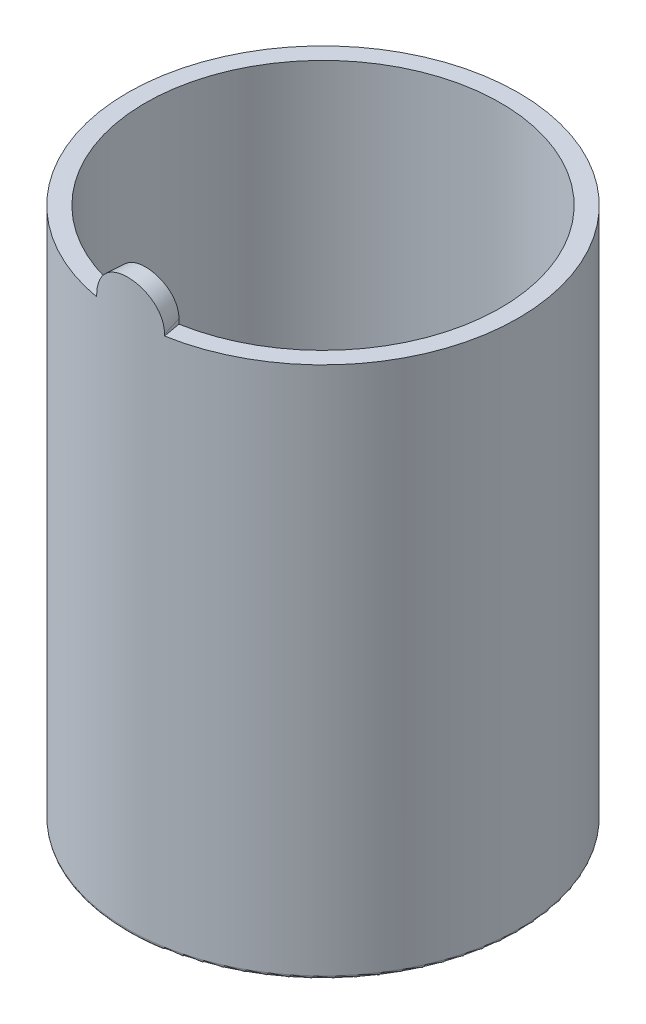
ISO-10303-21;
HEADER;
FILE_DESCRIPTION(('STEP AP214'),'2;1');
FILE_NAME('part.step','',(''),(''),'','','');
FILE_SCHEMA(('AUTOMOTIVE_DESIGN { 1 0 10303 214 1 1 1 1 }'));
ENDSEC;
DATA;
#1=APPLICATION_CONTEXT('core data for automotive mechanical design processes');
#2=APPLICATION_PROTOCOL_DEFINITION('international standard','automotive_design',2000,#1);
#3=PRODUCT_CONTEXT('',#1,'mechanical');
#4=PRODUCT('Part','Part','',(#3));
#5=PRODUCT_RELATED_PRODUCT_CATEGORY('part','',(#4));
#6=PRODUCT_DEFINITION_FORMATION('','',#4);
#7=PRODUCT_DEFINITION_CONTEXT('part definition',#1,'design');
#8=PRODUCT_DEFINITION('design','',#6,#7);
#9=PRODUCT_DEFINITION_SHAPE('','',#8);
#10=(LENGTH_UNIT() NAMED_UNIT(*) SI_UNIT(.MILLI.,.METRE.));
#11=(NAMED_UNIT(*) PLANE_ANGLE_UNIT() SI_UNIT($,.RADIAN.));
#12=(NAMED_UNIT(*) SI_UNIT($,.STERADIAN.) SOLID_ANGLE_UNIT());
#13=UNCERTAINTY_MEASURE_WITH_UNIT(LENGTH_MEASURE(1.E-05),#10,'distance_accuracy_value','');
#14=(GEOMETRIC_REPRESENTATION_CONTEXT(3) GLOBAL_UNCERTAINTY_ASSIGNED_CONTEXT((#13)) GLOBAL_UNIT_ASSIGNED_CONTEXT((#10,
#11,#12)) REPRESENTATION_CONTEXT('',''));
#15=CARTESIAN_POINT('',(0.,0.,0.));
#16=DIRECTION('',(0.,0.,1.));
#17=DIRECTION('',(1.,0.,0.));
#18=AXIS2_PLACEMENT_3D('',#15,#16,#17);
#19=CARTESIAN_POINT('',(8.58085137778468,151.419148622215,48.6644264156715));
#20=CARTESIAN_POINT('',(8.61470387963874,151.38529612036,48.856413493985));
#21=CARTESIAN_POINT('',(8.64855638149246,151.351443618508,49.0484005722966));
#22=CARTESIAN_POINT('',(8.72705560070568,151.272944399294,49.4935917670747));
#23=CARTESIAN_POINT('',(8.77170231806403,151.228297681933,49.7467958835348));
#24=CARTESIAN_POINT('',(9.06111594751122,150.938884052507,51.3881421385682));
#25=CARTESIAN_POINT('',(9.30588285959496,150.694117140408,52.7762842771128));
#26=CARTESIAN_POINT('',(9.59976116077606,150.400238839223,54.4429509437813));
#27=CARTESIAN_POINT('',(9.64887254987074,150.35112745013,54.7214754718902));
#28=CARTESIAN_POINT('',(9.7318364408196,150.26816355918,55.1919870783132));
#29=CARTESIAN_POINT('',(9.76568894267351,150.234311057327,55.3839741566259));
#30=CARTESIAN_POINT('',(9.79954144452749,150.200458555473,55.5759612349389));
#31=CARTESIAN_POINT('',(8.58085137778468,157.139716207405,48.6644264156715));
#32=CARTESIAN_POINT('',(8.61470387963876,157.128432040125,48.8564134939854));
#33=CARTESIAN_POINT('',(8.64855638149247,157.117147872837,49.0484005722966));
#34=CARTESIAN_POINT('',(8.72705560070566,157.09098146643,49.4935917670747));
#35=CARTESIAN_POINT('',(8.7717023180664,157.076099227313,49.7467958835348));
#36=CARTESIAN_POINT('',(9.06111594749822,156.979628017489,51.3881421385682));
#37=CARTESIAN_POINT('',(9.30588285958217,156.898039046809,52.7762842771127));
#38=CARTESIAN_POINT('',(9.59976116077862,156.800079613073,54.4429509437813));
#39=CARTESIAN_POINT('',(9.64887254987085,156.783709150045,54.7214754718902));
#40=CARTESIAN_POINT('',(9.73183644081956,156.756054519726,55.1919870783132));
#41=CARTESIAN_POINT('',(9.76568894267335,156.744770352438,55.3839741566255));
#42=CARTESIAN_POINT('',(9.79954144452751,156.733486185158,55.5759612349389));
#43=CARTESIAN_POINT('',(4.29042568889235,164.290425688892,48.6644264156715));
#44=CARTESIAN_POINT('',(4.30735193981926,164.307351939828,48.8564134939839));
#45=CARTESIAN_POINT('',(4.32427819074625,164.324278190746,49.0484005722973));
#46=CARTESIAN_POINT('',(4.36352780035284,164.363527800353,49.4935917670739));
#47=CARTESIAN_POINT('',(4.38585115903464,164.385851159039,49.7467958835357));
#48=CARTESIAN_POINT('',(4.53055797374129,164.530557973718,51.3881421385634));
#49=CARTESIAN_POINT('',(4.65294142978447,164.652941429777,52.7762842771079));
#50=CARTESIAN_POINT('',(4.79988058039065,164.799880580392,54.4429509437823));
#51=CARTESIAN_POINT('',(4.82443627493544,164.824436274935,54.7214754718901));
#52=CARTESIAN_POINT('',(4.8659182204098,164.86591822041,55.1919870783132));
#53=CARTESIAN_POINT('',(4.88284447133693,164.882844471331,55.3839741566263));
#54=CARTESIAN_POINT('',(4.89977072226378,164.899770722264,55.5759612349389));
#55=CARTESIAN_POINT('',(-4.2904256888923,164.290425688892,48.6644264156715));
#56=CARTESIAN_POINT('',(-4.30735193981929,164.307351939828,48.8564134939838));
#57=CARTESIAN_POINT('',(-4.3242781907462,164.324278190746,49.0484005722972));
#58=CARTESIAN_POINT('',(-4.3635278003528,164.363527800353,49.4935917670739));
#59=CARTESIAN_POINT('',(-4.38585115903438,164.385851159039,49.7467958835356));
#60=CARTESIAN_POINT('',(-4.53055797374245,164.530557973718,51.3881421385634));
#61=CARTESIAN_POINT('',(-4.65294142978504,164.652941429777,52.7762842771079));
#62=CARTESIAN_POINT('',(-4.79988058039049,164.799880580392,54.4429509437823));
#63=CARTESIAN_POINT('',(-4.82443627493517,164.824436274935,54.7214754718901));
#64=CARTESIAN_POINT('',(-4.86591822040993,164.86591822041,55.1919870783132));
#65=CARTESIAN_POINT('',(-4.88284447133689,164.882844471331,55.3839741566262));
#66=CARTESIAN_POINT('',(-4.89977072226374,164.899770722264,55.5759612349389));
#67=CARTESIAN_POINT('',(-8.58085137778463,157.139716207405,48.6644264156715));
#68=CARTESIAN_POINT('',(-8.61470387963888,157.128432040125,48.8564134939853));
#69=CARTESIAN_POINT('',(-8.64855638149243,157.117147872837,49.0484005722966));
#70=CARTESIAN_POINT('',(-8.72705560070562,157.09098146643,49.4935917670747));
#71=CARTESIAN_POINT('',(-8.77170231806614,157.076099227313,49.7467958835348));
#72=CARTESIAN_POINT('',(-9.06111594749938,156.979628017489,51.3881421385682));
#73=CARTESIAN_POINT('',(-9.30588285958334,156.898039046809,52.7762842771127));
#74=CARTESIAN_POINT('',(-9.59976116077835,156.800079613073,54.4429509437813));
#75=CARTESIAN_POINT('',(-9.64887254987057,156.783709150045,54.7214754718901));
#76=CARTESIAN_POINT('',(-9.73183644081969,156.756054519726,55.1919870783132));
#77=CARTESIAN_POINT('',(-9.76568894267331,156.744770352438,55.3839741566255));
#78=CARTESIAN_POINT('',(-9.79954144452748,156.733486185158,55.5759612349389));
#79=CARTESIAN_POINT('',(-8.58085137778463,151.419148622215,48.6644264156715));
#80=CARTESIAN_POINT('',(-8.61470387963869,151.38529612036,48.856413493985));
#81=CARTESIAN_POINT('',(-8.64855638149241,151.351443618508,49.0484005722966));
#82=CARTESIAN_POINT('',(-8.72705560070564,151.272944399294,49.4935917670747));
#83=CARTESIAN_POINT('',(-8.77170231806399,151.228297681933,49.7467958835348));
#84=CARTESIAN_POINT('',(-9.06111594751118,150.938884052507,51.3881421385682));
#85=CARTESIAN_POINT('',(-9.30588285959493,150.694117140408,52.7762842771128));
#86=CARTESIAN_POINT('',(-9.59976116077602,150.400238839223,54.4429509437813));
#87=CARTESIAN_POINT('',(-9.6488725498707,150.35112745013,54.7214754718901));
#88=CARTESIAN_POINT('',(-9.73183644081958,150.26816355918,55.1919870783132));
#89=CARTESIAN_POINT('',(-9.76568894267348,150.234311057327,55.3839741566258));
#90=CARTESIAN_POINT('',(-9.79954144452747,150.200458555473,55.5759612349389));
#91=(BOUNDED_SURFACE() B_SPLINE_SURFACE(5,3,((#19,#20,#21,#22,#23,#24,#25,#26,#27,#28,#29,#30),
(#31,#32,#33,#34,#35,#36,#37,#38,#39,#40,#41,#42),(#43,#44,#45,#46,#47,#48,#49,#50,#51,#52,#53,
#54),(#55,#56,#57,#58,#59,#60,#61,#62,#63,#64,#65,#66),(#67,#68,#69,#70,#71,#72,#73,#74,#75,#76,
#77,#78),(#79,#80,#81,#82,#83,#84,#85,#86,#87,#88,#89,#90)),.UNSPECIFIED.,.F.,.F.,
.F.) B_SPLINE_SURFACE_WITH_KNOTS((6,6),(4,2,2,2,2,4),(0.,1.),(-0.11696927307432,0.,
0.154266118857451,0.999999999999997,1.1696927307432,1.28666200381752),
.UNSPECIFIED.) GEOMETRIC_REPRESENTATION_ITEM() RATIONAL_B_SPLINE_SURFACE(((1.,1.,1.,1.,1.,1.,1.,
1.,1.,1.,1.,1.),(0.6,0.6,0.6,0.6,0.6,0.6,0.6,0.6,0.599999999999999,0.599999999999999,
0.599999999999999,0.599999999999999),(0.4,0.4,0.4,0.4,0.4,0.4,0.4,0.4,0.399999999999998,
0.399999999999998,0.399999999999998,0.399999999999998),(0.4,0.4,0.4,0.4,0.4,0.4,0.4,0.4,
0.399999999999998,0.399999999999998,0.399999999999998,0.399999999999998),(0.6,0.6,0.6,0.6,0.6,
0.6,0.6,0.6,0.599999999999999,0.599999999999999,0.599999999999999,0.599999999999999),(1.,1.,1.,
1.,1.,1.,1.,1.,1.,1.,1.,1.))) REPRESENTATION_ITEM('') SURFACE());
#92=CARTESIAN_POINT('',(-8.58085137778463,151.419148622215,48.6644264156715));
#93=CARTESIAN_POINT('',(-8.61470387963869,151.38529612036,48.856413493985));
#94=CARTESIAN_POINT('',(-8.64855638149241,151.351443618508,49.0484005722966));
#95=CARTESIAN_POINT('',(-8.72705560070564,151.272944399294,49.4935917670747));
#96=CARTESIAN_POINT('',(-8.77170231806399,151.228297681933,49.7467958835348));
#97=CARTESIAN_POINT('',(-9.06111594751118,150.938884052507,51.3881421385682));
#98=CARTESIAN_POINT('',(-9.30588285959493,150.694117140408,52.7762842771128));
#99=CARTESIAN_POINT('',(-9.59976116077602,150.400238839223,54.4429509437813));
#100=CARTESIAN_POINT('',(-9.6488725498707,150.35112745013,54.7214754718901));
#101=CARTESIAN_POINT('',(-9.73183644081958,150.26816355918,55.1919870783132));
#102=CARTESIAN_POINT('',(-9.76568894267348,150.234311057327,55.3839741566258));
#103=CARTESIAN_POINT('',(-9.79954144452747,150.200458555473,55.5759612349389));
#104=(BOUNDED_CURVE() B_SPLINE_CURVE(3,(#92,#93,#94,#95,#96,#97,#98,#99,#100,#101,#102,#103),
.UNSPECIFIED.,.F.,.F.) B_SPLINE_CURVE_WITH_KNOTS((4,2,2,2,2,4),(-0.11696927307432,0.,
0.154266118857451,0.999999999999997,1.1696927307432,1.28666200381752),
.UNSPECIFIED.) CURVE() GEOMETRIC_REPRESENTATION_ITEM() RATIONAL_B_SPLINE_CURVE((1.,1.,1.,1.,1.,
1.,1.,1.,1.,1.,1.,1.)) REPRESENTATION_ITEM(''));
#105=CARTESIAN_POINT('',(-9.55064977168117,150.449350228319,54.1644264156714));
#106=VERTEX_POINT('',#105);
#107=CARTESIAN_POINT('',(-8.68240888334653,151.317591116653,49.2403876506104));
#108=VERTEX_POINT('',#107);
#109=EDGE_CURVE('E161',#106,#108,#104,.F.);
#110=CARTESIAN_POINT('',(-9.55064977168117,150.449350228319,54.1644264156714));
#111=CARTESIAN_POINT('',(-9.5506535685371,150.597409407949,54.1644287352721));
#112=CARTESIAN_POINT('',(-9.5473216110073,150.745470018745,54.1650766797636));
#113=CARTESIAN_POINT('',(-9.5338295016703,151.04430645453,54.1676210395033));
#114=CARTESIAN_POINT('',(-9.52353098369442,151.195075824867,54.169542737472));
#115=CARTESIAN_POINT('',(-9.49568386534433,151.498796829329,54.1746341863346));
#116=CARTESIAN_POINT('',(-9.47800197290987,151.651735880486,54.1778268294253));
#117=CARTESIAN_POINT('',(-9.43502290723178,151.959191725334,54.185463076538));
#118=CARTESIAN_POINT('',(-9.40960007065128,152.113690457194,54.1899272381665));
#119=CARTESIAN_POINT('',(-9.3508364700615,152.423595321149,54.2001089807624));
#120=CARTESIAN_POINT('',(-9.31738009640373,152.578978946388,54.2058447591902));
#121=CARTESIAN_POINT('',(-9.24232335870648,152.889925216602,54.2185706332216));
#122=CARTESIAN_POINT('',(-9.2006198046076,153.04546232234,54.2255765170878));
#123=CARTESIAN_POINT('',(-9.10893241810317,153.355937103522,54.2408505168145));
#124=CARTESIAN_POINT('',(-9.05886000531014,153.510847954753,54.2491320522183));
#125=CARTESIAN_POINT('',(-8.9503907815381,153.819262767939,54.2669385970038));
#126=CARTESIAN_POINT('',(-8.89192180670214,153.972740779682,54.2764743185022));
#127=CARTESIAN_POINT('',(-8.78197011454437,154.24037723101,54.294390989843));
#128=CARTESIAN_POINT('',(-8.7321197008405,154.355227406441,54.3025093750125));
#129=CARTESIAN_POINT('',(-8.62458436067724,154.590152047399,54.3199234314806));
#130=CARTESIAN_POINT('',(-8.566601753074,154.710087399908,54.3292612395153));
#131=CARTESIAN_POINT('',(-8.4417933353155,154.954916110535,54.3491026231285));
#132=CARTESIAN_POINT('',(-8.37463959583191,155.0796393903,54.3596425698713));
#133=CARTESIAN_POINT('',(-8.23040777749697,155.333646532045,54.3818973625209));
#134=CARTESIAN_POINT('',(-8.15297118815106,155.462724119764,54.3936444135904));
#135=CARTESIAN_POINT('',(-7.9870280350186,155.724879419217,54.4183166458469));
#136=CARTESIAN_POINT('',(-7.89813275839116,155.857708631121,54.4312697076988));
#137=CARTESIAN_POINT('',(-7.7080826917411,156.126611081487,54.4583566793234));
#138=CARTESIAN_POINT('',(-7.60651075322208,156.262387049964,54.4725143947566));
#139=CARTESIAN_POINT('',(-7.38988487790479,156.536214402724,54.5020209417706));
#140=CARTESIAN_POINT('',(-7.27438772343005,156.673913985754,54.5173902894626));
#141=CARTESIAN_POINT('',(-7.09279141229966,156.878250487114,54.5409774043178));
#142=CARTESIAN_POINT('',(-7.02947277310226,156.947389724244,54.5491015432852));
#143=CARTESIAN_POINT('',(-6.89896582629124,157.085694556023,54.5656767556198));
#144=CARTESIAN_POINT('',(-6.83171863940803,157.154804369302,54.5741305347192));
#145=CARTESIAN_POINT('',(-6.68002490489271,157.305980465333,54.5928586535595));
#146=CARTESIAN_POINT('',(-6.59506349121255,157.38753224599,54.6031221749928));
#147=CARTESIAN_POINT('',(-6.42521677181039,157.544546216311,54.6230638137401));
#148=CARTESIAN_POINT('',(-6.34043720425053,157.620121875068,54.632749744968));
#149=CARTESIAN_POINT('',(-6.17161287370757,157.76523403988,54.6515810319803));
#150=CARTESIAN_POINT('',(-6.08767248292686,157.834891185755,54.6607325856161));
#151=CARTESIAN_POINT('',(-5.92115668866285,157.96827364556,54.6784837369738));
#152=CARTESIAN_POINT('',(-5.83868300409595,158.032125126884,54.6870899339919));
#153=CARTESIAN_POINT('',(-5.67569941967905,158.154053908913,54.7037533801472));
#154=CARTESIAN_POINT('',(-5.59528739051011,158.212261122935,54.7118170511148));
#155=CARTESIAN_POINT('',(-5.43699385117522,158.323098202843,54.7273944518537));
#156=CARTESIAN_POINT('',(-5.35920515876667,158.375860057953,54.7349146237307));
#157=CARTESIAN_POINT('',(-5.13746029864785,158.521502189522,54.7559813946229));
#158=CARTESIAN_POINT('',(-4.99170588020331,158.611686172171,54.7693972906763));
#159=CARTESIAN_POINT('',(-4.71575576698027,158.77229039469,54.7940129618569));
#160=CARTESIAN_POINT('',(-4.58615405209426,158.843727651101,54.8052651489785));
#161=CARTESIAN_POINT('',(-4.34551359994838,158.969160561938,54.8255301988701));
#162=CARTESIAN_POINT('',(-4.23496295167097,159.02408344893,54.8346048319453));
#163=CARTESIAN_POINT('',(-4.03477765760033,159.11874617059,54.850562705941));
#164=CARTESIAN_POINT('',(-3.94552486863572,159.159283240331,54.8575123311363));
#165=CARTESIAN_POINT('',(-3.7896697760701,159.22719603415,54.8690469334522));
#166=CARTESIAN_POINT('',(-3.72335281715906,159.255206058268,54.8737694365951));
#167=CARTESIAN_POINT('',(-3.50521304908699,159.34445153733,54.8886189172679));
#168=CARTESIAN_POINT('',(-3.35204877863051,159.402574116981,54.8979697454393));
#169=CARTESIAN_POINT('',(-3.04446373919018,159.510382897638,54.9155963244995));
#170=CARTESIAN_POINT('',(-2.89007106822606,159.560148014119,54.9238819355062));
#171=CARTESIAN_POINT('',(-2.58076993152629,159.65128517241,54.9391193934436));
#172=CARTESIAN_POINT('',(-2.4258896969307,159.692750438671,54.9460860009768));
#173=CARTESIAN_POINT('',(-2.11636659959782,159.7674044439,54.9587509245));
#174=CARTESIAN_POINT('',(-1.96175006934257,159.800699701357,54.9644654462239));
#175=CARTESIAN_POINT('',(-1.65346526736911,159.859210430964,54.974606026102));
#176=CARTESIAN_POINT('',(-1.49982008050694,159.884544298276,54.9790508650643));
#177=CARTESIAN_POINT('',(-1.19414937167681,159.927398472971,54.9866543968209));
#178=CARTESIAN_POINT('',(-1.04214240762811,159.945047478872,54.9898341901939));
#179=CARTESIAN_POINT('',(-0.740369565030298,159.972860168167,54.9949038482551));
#180=CARTESIAN_POINT('',(-0.590616727797302,159.98316112855,54.996817318513));
#181=CARTESIAN_POINT('',(-0.293919023119358,159.996658693939,54.9993523583421));
#182=CARTESIAN_POINT('',(-0.146980921576725,159.99999935565,55.0000001064778));
#183=CARTESIAN_POINT('',(0.147543144065185,160.000000647001,54.9999998930196));
#184=CARTESIAN_POINT('',(0.295129109159439,159.996631769178,54.9993462079388));
#185=CARTESIAN_POINT('',(0.593169821972205,159.983015887643,54.9967871182881));
#186=CARTESIAN_POINT('',(0.743617629851791,159.972621796414,54.9948549648816));
#187=CARTESIAN_POINT('',(1.04681958882936,159.944552569814,54.989736198051));
#188=CARTESIAN_POINT('',(1.19956036129286,159.926737226849,54.9865254835967));
#189=CARTESIAN_POINT('',(1.50672810416115,159.883472618951,54.97884822365));
#190=CARTESIAN_POINT('',(1.66113602885559,159.857891882185,54.974360140636));
#191=CARTESIAN_POINT('',(1.97096459827754,159.798803396461,54.9641209405296));
#192=CARTESIAN_POINT('',(2.12636154568648,159.76517469281,54.958350658152));
#193=CARTESIAN_POINT('',(2.43745153536883,159.689764983967,54.9455628945515));
#194=CARTESIAN_POINT('',(2.59311754483361,159.64787516652,54.9385288921433));
#195=CARTESIAN_POINT('',(2.90398265647401,159.555797181141,54.923141914837));
#196=CARTESIAN_POINT('',(3.05915277612907,159.505513808978,54.9147738639996));
#197=CARTESIAN_POINT('',(3.36827248299225,159.396575360958,54.8969804500189));
#198=CARTESIAN_POINT('',(3.52219324303798,159.337839734448,54.8875451257469));
#199=CARTESIAN_POINT('',(3.73953021585882,159.248415185785,54.8726653839171));
#200=CARTESIAN_POINT('',(3.80432861076991,159.220912802046,54.8680273221353));
#201=CARTESIAN_POINT('',(3.95756638607769,159.153866560966,54.8566354487086));
#202=CARTESIAN_POINT('',(4.04571913236435,159.11368835347,54.8497426304507));
#203=CARTESIAN_POINT('',(4.24411973252336,159.019591870635,54.8338713131959));
#204=CARTESIAN_POINT('',(4.35398148885269,158.964869622866,54.8248273942886));
#205=CARTESIAN_POINT('',(4.59364036631751,158.839666858394,54.8045958633124));
#206=CARTESIAN_POINT('',(4.72294174199317,158.768246486401,54.7933467229786));
#207=CARTESIAN_POINT('',(4.99865089862459,158.607472482046,54.7687099454469));
#208=CARTESIAN_POINT('',(5.14445350922731,158.517084472317,54.7552700641541));
#209=CARTESIAN_POINT('',(5.36638004358167,158.371040821881,54.7341590434615));
#210=CARTESIAN_POINT('',(5.44430529932368,158.318081185652,54.7266165322257));
#211=CARTESIAN_POINT('',(5.6029368814386,158.206780414531,54.7109877008393));
#212=CARTESIAN_POINT('',(5.6835483313485,158.148304623598,54.7028949005111));
#213=CARTESIAN_POINT('',(5.8469850859634,158.025766023871,54.6861664580029));
#214=CARTESIAN_POINT('',(5.92971027251633,157.961570599853,54.677524339363));
#215=CARTESIAN_POINT('',(6.09677161534469,157.827423792447,54.6596946023901));
#216=CARTESIAN_POINT('',(6.18100365256058,157.757343569061,54.6505003113948));
#217=CARTESIAN_POINT('',(6.35044094411668,157.611306064769,54.6315769289031));
#218=CARTESIAN_POINT('',(6.43553931386723,157.535225568937,54.6218415624887));
#219=CARTESIAN_POINT('',(6.60603953608151,157.377121314732,54.6017939895277));
#220=CARTESIAN_POINT('',(6.69133307464184,157.29498167124,54.5914738424639));
#221=CARTESIAN_POINT('',(6.84318795630208,157.143116415535,54.5726935356835));
#222=CARTESIAN_POINT('',(6.91028332512391,157.073922585546,54.5642443547432));
#223=CARTESIAN_POINT('',(7.04049953046573,156.935446749518,54.5476785972382));
#224=CARTESIAN_POINT('',(7.10367896639197,156.866220074487,54.5395592835005));
#225=CARTESIAN_POINT('',(7.28489547080396,156.661602837184,54.5159846817464));
#226=CARTESIAN_POINT('',(7.40014768382161,156.523714486896,54.5006250927717));
#227=CARTESIAN_POINT('',(7.61632380322519,156.249489245559,54.4711386376469));
#228=CARTESIAN_POINT('',(7.71768901862373,156.113501443741,54.4569910320722));
#229=CARTESIAN_POINT('',(7.90735785944487,155.84415059538,54.4299247902354));
#230=CARTESIAN_POINT('',(7.99607698509354,155.711082591047,54.4169821531003));
#231=CARTESIAN_POINT('',(8.16169288869426,155.448422224563,54.3923312619217));
#232=CARTESIAN_POINT('',(8.23897699110962,155.319076538754,54.3805949666192));
#233=CARTESIAN_POINT('',(8.3829225495086,155.06450418623,54.358362120494));
#234=CARTESIAN_POINT('',(8.449941380559,154.939482299414,54.3478332473663));
#235=CARTESIAN_POINT('',(8.57449323565003,154.69402675686,54.3280144471347));
#236=CARTESIAN_POINT('',(8.63235328933338,154.573761947292,54.3186880766055));
#237=CARTESIAN_POINT('',(8.73965221258541,154.338148682424,54.3012971291823));
#238=CARTESIAN_POINT('',(8.78938807631912,154.222938323595,54.2931904177412));
#239=CARTESIAN_POINT('',(8.89855897948337,153.955665883465,54.2753860753383));
#240=CARTESIAN_POINT('',(8.95641440054314,153.802938292643,54.2659429083387));
#241=CARTESIAN_POINT('',(9.06375351143984,153.496044177792,54.2483091508087));
#242=CARTESIAN_POINT('',(9.11330762731185,153.341902842018,54.2401080864366));
#243=CARTESIAN_POINT('',(9.20405414341089,153.0329751713,54.2249823545023));
#244=CARTESIAN_POINT('',(9.24533313028994,152.878214918862,54.2180445478993));
#245=CARTESIAN_POINT('',(9.3196335158236,152.568819145975,54.2054421984728));
#246=CARTESIAN_POINT('',(9.35275590036945,152.414208492683,54.199762182405));
#247=CARTESIAN_POINT('',(9.41093972314833,152.105836172898,54.1896792767264));
#248=CARTESIAN_POINT('',(9.43611441134237,151.952096445648,54.1852585413742));
#249=CARTESIAN_POINT('',(9.47867949658302,151.646136240545,54.1776964224487));
#250=CARTESIAN_POINT('',(9.49619309862979,151.493933386767,54.1745348693886));
#251=CARTESIAN_POINT('',(9.5237790990477,151.191654809968,54.1694928513943));
#252=CARTESIAN_POINT('',(9.53398228817034,151.04159137648,54.1675899187436));
#253=CARTESIAN_POINT('',(9.54735154803956,150.744130696259,54.1650702487952));
#254=CARTESIAN_POINT('',(9.55065349707637,150.596739759346,54.1644286916592));
#255=CARTESIAN_POINT('',(9.55064977168119,150.449350228319,54.1644264156714));
#256=B_SPLINE_CURVE_WITH_KNOTS('',3,(#110,#111,#112,#113,#114,#115,#116,#117,#118,#119,#120,
#121,#122,#123,#124,#125,#126,#127,#128,#129,#130,#131,#132,#133,#134,#135,#136,#137,#138,#139,
#140,#141,#142,#143,#144,#145,#146,#147,#148,#149,#150,#151,#152,#153,#154,#155,#156,#157,#158,
#159,#160,#161,#162,#163,#164,#165,#166,#167,#168,#169,#170,#171,#172,#173,#174,#175,#176,#177,
#178,#179,#180,#181,#182,#183,#184,#185,#186,#187,#188,#189,#190,#191,#192,#193,#194,#195,#196,
#197,#198,#199,#200,#201,#202,#203,#204,#205,#206,#207,#208,#209,#210,#211,#212,#213,#214,#215,
#216,#217,#218,#219,#220,#221,#222,#223,#224,#225,#226,#227,#228,#229,#230,#231,#232,#233,#234,
#235,#236,#237,#238,#239,#240,#241,#242,#243,#244,#245,#246,#247,#248,#249,#250,#251,#252,#253,
#254,#255),.UNSPECIFIED.,.F.,.F.,(4,2,2,2,2,2,2,2,2,2,2,2,2,2,2,2,2,2,2,2,2,2,2,2,2,2,2,2,2,2,2,
2,2,2,2,2,2,2,2,2,2,2,2,2,2,2,2,2,2,2,2,2,2,2,2,2,2,2,2,2,2,2,2,2,2,2,2,2,2,2,2,2,4),(0.,
0.444141154350133,0.89737316076882,1.35916756835706,1.82889900858098,2.30584475254411,
2.7891860456927,3.27801138977919,3.77132188003904,4.14762494987654,4.54813171553715,
4.9741213572125,5.42689343589815,5.90774994856074,6.41797200451023,6.95879036990883,
7.2410664622741,7.53141436198007,7.88597021659119,8.22785820665664,8.55617759349047,
8.87009080900052,9.16882532402452,9.451674303291,9.96716638998523,10.4122510076047,
10.7834836392453,11.0782540155704,11.294672449111,11.7866926109341,12.2737679434259,
12.7550204407728,13.2296182195801,13.6967817127036,14.155788744857,14.6059784642168,
15.0467541429292,15.4894725618352,15.9417597339575,16.4030099495565,16.8725516807683,
17.3496504281135,17.8335127406706,18.32329142454,18.818091913627,19.0297162297449,
19.3210351601364,19.6901498897843,20.1344236817097,20.6503644405662,20.9338886069685,
21.2335837902032,21.5487295035506,21.8785376043867,22.2221529405561,22.5786552605302,
22.8688660561601,23.1510530644152,23.6918316030345,24.2021885811837,24.6833433597297,
25.1365661198326,25.5631486479786,25.9643811694542,26.3415344944151,26.8320795228701,
27.3182252516695,27.7989829850061,28.2734498009189,28.740813825047,29.2003575008127,
29.6514589586549,30.0935916471516),.UNSPECIFIED.);
#257=CARTESIAN_POINT('',(9.5506497716812,150.449350228319,54.1644264156714));
#258=VERTEX_POINT('',#257);
#259=EDGE_CURVE('E51',#258,#106,#256,.F.);
#260=CARTESIAN_POINT('',(9.79954144452749,150.200458555473,55.5759612349389));
#261=CARTESIAN_POINT('',(9.76568894267351,150.234311057327,55.3839741566259));
#262=CARTESIAN_POINT('',(9.7318364408196,150.26816355918,55.1919870783132));
#263=CARTESIAN_POINT('',(9.64887254987074,150.35112745013,54.7214754718902));
#264=CARTESIAN_POINT('',(9.59976116077606,150.400238839223,54.4429509437813));
#265=CARTESIAN_POINT('',(9.30588285959496,150.694117140408,52.7762842771128));
#266=CARTESIAN_POINT('',(9.06111594751122,150.938884052507,51.3881421385682));
#267=CARTESIAN_POINT('',(8.77170231806403,151.228297681933,49.7467958835348));
#268=CARTESIAN_POINT('',(8.72705560070568,151.272944399294,49.4935917670747));
#269=CARTESIAN_POINT('',(8.64855638149246,151.351443618508,49.0484005722966));
#270=CARTESIAN_POINT('',(8.61470387963874,151.38529612036,48.856413493985));
#271=CARTESIAN_POINT('',(8.58085137778468,151.419148622215,48.6644264156715));
#272=(BOUNDED_CURVE() B_SPLINE_CURVE(3,(#260,#261,#262,#263,#264,#265,#266,#267,#268,#269,#270,
#271),.UNSPECIFIED.,.F.,.F.) B_SPLINE_CURVE_WITH_KNOTS((4,2,2,2,2,4),(-0.11696927307432,0.,
0.169692730743206,1.01542661188575,1.1696927307432,1.28666200381752),
.UNSPECIFIED.) CURVE() GEOMETRIC_REPRESENTATION_ITEM() RATIONAL_B_SPLINE_CURVE((1.,1.,1.,1.,1.,
1.,1.,1.,1.,1.,1.,1.)) REPRESENTATION_ITEM(''));
#273=CARTESIAN_POINT('',(8.68240888334657,151.317591116653,49.2403876506104));
#274=VERTEX_POINT('',#273);
#275=EDGE_CURVE('E127',#274,#258,#272,.F.);
#276=CARTESIAN_POINT('',(8.68240888334656,151.317591116653,49.2403876506104));
#277=CARTESIAN_POINT('',(8.68241233160263,151.452158478602,49.2403897572074));
#278=CARTESIAN_POINT('',(8.67938471151017,151.586727140401,49.2409784925719));
#279=CARTESIAN_POINT('',(8.66712502133586,151.858331098623,49.2432903677351));
#280=CARTESIAN_POINT('',(8.65776728310979,151.995360534139,49.2450364696265));
#281=CARTESIAN_POINT('',(8.63246418777277,152.27140181884,49.2496626985917));
#282=CARTESIAN_POINT('',(8.61639777604903,152.410402243069,49.2525636163923));
#283=CARTESIAN_POINT('',(8.57734566819237,152.689836289723,49.2595021191331));
#284=CARTESIAN_POINT('',(8.55424585064835,152.830253513358,49.2635583741968));
#285=CARTESIAN_POINT('',(8.50085208962747,153.111912173236,49.2728097822703));
#286=CARTESIAN_POINT('',(8.47045315977471,153.253133176018,49.2780214615217));
#287=CARTESIAN_POINT('',(8.40225589837955,153.535737708183,49.2895845425229));
#288=CARTESIAN_POINT('',(8.36436386359596,153.677098052448,49.2959502822168));
#289=CARTESIAN_POINT('',(8.28105665264543,153.959274118296,49.3098286393936));
#290=CARTESIAN_POINT('',(8.23556104466113,154.100065489963,49.3173534426825));
#291=CARTESIAN_POINT('',(8.13700667721341,154.380370124369,49.3335330183665));
#292=CARTESIAN_POINT('',(8.0838823979281,154.519859832793,49.3421975185577));
#293=CARTESIAN_POINT('',(7.98398814230157,154.763088526816,49.358475840871));
#294=CARTESIAN_POINT('',(7.93870191722651,154.867456102539,49.3658510585049));
#295=CARTESIAN_POINT('',(7.84101998506261,155.080924530445,49.3816696028363));
#296=CARTESIAN_POINT('',(7.78835454441338,155.189899371926,49.390151100242));
#297=CARTESIAN_POINT('',(7.67500055550682,155.412340553005,49.4081718149477));
#298=CARTESIAN_POINT('',(7.61401492578913,155.525652868417,49.417743998313));
#299=CARTESIAN_POINT('',(7.48304149195106,155.756408535235,49.4379543280483));
#300=CARTESIAN_POINT('',(7.41272896182368,155.873665126974,49.4486216751012));
#301=CARTESIAN_POINT('',(7.26206443476776,156.111801374541,49.4710252561063));
#302=CARTESIAN_POINT('',(7.1813604143277,156.23245609229,49.4827867827949));
#303=CARTESIAN_POINT('',(7.00883601384426,156.476703673804,49.5073811724808));
#304=CARTESIAN_POINT('',(6.91663791205598,156.600027514852,49.5202356441276));
#305=CARTESIAN_POINT('',(6.72001873678076,156.848736305011,49.5470252314407));
#306=CARTESIAN_POINT('',(6.61519638230906,156.973802950324,49.5609789818058));
#307=CARTESIAN_POINT('',(6.45039102911192,157.159397112073,49.5823936416407));
#308=CARTESIAN_POINT('',(6.39293065622443,157.222193032525,49.589769227004));
#309=CARTESIAN_POINT('',(6.27450231980271,157.34780917038,49.6048170196099));
#310=CARTESIAN_POINT('',(6.21348105294024,157.410578932258,49.6124916848042));
#311=CARTESIAN_POINT('',(6.07566852348723,157.548054555621,49.6295143118148));
#312=CARTESIAN_POINT('',(5.99840409663428,157.622288050418,49.6388523878108));
#313=CARTESIAN_POINT('',(5.84395214261946,157.76520073409,49.6569948179218));
#314=CARTESIAN_POINT('',(5.76686135737204,157.833983646524,49.6658062995588));
#315=CARTESIAN_POINT('',(5.61335841812015,157.966041556161,49.6829363252738));
#316=CARTESIAN_POINT('',(5.53704173901129,158.02942681541,49.6912605163865));
#317=CARTESIAN_POINT('',(5.3856626141511,158.150787769693,49.707405615318));
#318=CARTESIAN_POINT('',(5.31069319599665,158.208878756925,49.7152325324224));
#319=CARTESIAN_POINT('',(5.16255540387677,158.319795476269,49.7303858220464));
#320=CARTESIAN_POINT('',(5.08947651613924,158.372739895201,49.7377180369086));
#321=CARTESIAN_POINT('',(4.94563716234682,158.473543533659,49.7518810281387));
#322=CARTESIAN_POINT('',(4.87496153940165,158.521523301777,49.7587176598195));
#323=CARTESIAN_POINT('',(4.67355936647845,158.653924338411,49.7778640921799));
#324=CARTESIAN_POINT('',(4.54120046762842,158.73590016281,49.790055990135));
#325=CARTESIAN_POINT('',(4.2907162883745,158.881837286308,49.8124193319652));
#326=CARTESIAN_POINT('',(4.17313338433866,158.946726321146,49.822638260141));
#327=CARTESIAN_POINT('',(3.95493982848574,159.060608601102,49.8410344631975));
#328=CARTESIAN_POINT('',(3.85477443415473,159.110446661095,49.8492676767192));
#329=CARTESIAN_POINT('',(3.67355870381806,159.196284695898,49.8637366088815));
#330=CARTESIAN_POINT('',(3.59285622792761,159.23300977959,49.8700322223166));
#331=CARTESIAN_POINT('',(3.45214346069524,159.294460092768,49.8804676752378));
#332=CARTESIAN_POINT('',(3.39239257068648,159.319760633635,49.884732624914));
#333=CARTESIAN_POINT('',(3.19429673528127,159.401037362595,49.8982537329093));
#334=CARTESIAN_POINT('',(3.0547155206763,159.454153645515,49.9067941136787));
#335=CARTESIAN_POINT('',(2.77440096517878,159.552673326074,49.9228948449373));
#336=CARTESIAN_POINT('',(2.63369349908551,159.598149204868,49.9304642224557));
#337=CARTESIAN_POINT('',(2.35180564888191,159.681427753039,49.944383999828));
#338=CARTESIAN_POINT('',(2.21065126876289,159.71931606703,49.9507479554891));
#339=CARTESIAN_POINT('',(1.92856043140402,159.787526484018,49.9623173734557));
#340=CARTESIAN_POINT('',(1.78764822954257,159.817946458151,49.967537712435));
#341=CARTESIAN_POINT('',(1.50669360860891,159.871400975486,49.9768012789842));
#342=CARTESIAN_POINT('',(1.36667245277603,159.894544306288,49.9808617531554));
#343=CARTESIAN_POINT('',(1.08811541508884,159.933690191981,49.9878077289847));
#344=CARTESIAN_POINT('',(0.949596624956432,159.949810997231,49.9907126102277));
#345=CARTESIAN_POINT('',(0.674613769645478,159.975213461941,49.9953439541719));
#346=CARTESIAN_POINT('',(0.538161713509912,159.984621241069,49.9970921004358));
#347=CARTESIAN_POINT('',(0.267831501297859,159.996947681526,49.9994080240792));
#348=CARTESIAN_POINT('',(0.133959575250677,159.999998670902,49.9999998555835));
#349=CARTESIAN_POINT('',(-0.134050068339481,160.000001330864,50.0000001445496));
#350=CARTESIAN_POINT('',(-0.268187786166377,159.996940886268,49.9994062514558));
#351=CARTESIAN_POINT('',(-0.539068850703301,159.984570178368,49.9970812139198));
#352=CARTESIAN_POINT('',(-0.675805898502214,159.975126352229,49.9953257829109));
#353=CARTESIAN_POINT('',(-0.951374688670432,159.949623012658,49.9906750557693));
#354=CARTESIAN_POINT('',(-1.09019428632368,159.933436186021,49.987757874227));
#355=CARTESIAN_POINT('',(-1.36936489788027,159.894126425349,49.9807824249309));
#356=CARTESIAN_POINT('',(-1.50969862289366,159.870884112023,49.9767045996648));
#357=CARTESIAN_POINT('',(-1.79128579012728,159.817197248252,49.9674013595572));
#358=CARTESIAN_POINT('',(-1.93251772104087,159.786642868984,49.9621585416859));
#359=CARTESIAN_POINT('',(-2.21525042055069,159.718127311215,49.9505395188747));
#360=CARTESIAN_POINT('',(-2.35672664988524,159.680067329315,49.9441483089435));
#361=CARTESIAN_POINT('',(-2.63925503100629,159.596407935107,49.93016801281));
#362=CARTESIAN_POINT('',(-2.78028087424665,159.550722074566,49.9225652429758));
#363=CARTESIAN_POINT('',(-3.06122383491489,159.451744350254,49.9063968201896));
#364=CARTESIAN_POINT('',(-3.20111478219311,159.398379342859,49.8978220986346));
#365=CARTESIAN_POINT('',(-3.3988972995349,159.317026892669,49.8842882739117));
#366=CARTESIAN_POINT('',(-3.45804161608839,159.291929153635,49.8800570830455));
#367=CARTESIAN_POINT('',(-3.5977074770071,159.230825382024,49.8696787876392));
#368=CARTESIAN_POINT('',(-3.67796912476678,159.194244067527,49.8634059966683));
#369=CARTESIAN_POINT('',(-3.85846777375962,159.108633552685,49.8489719881924));
#370=CARTESIAN_POINT('',(-3.95835524974928,159.058876622564,49.8407512658451));
#371=CARTESIAN_POINT('',(-4.17615004225702,158.945088926664,49.8223689906989));
#372=CARTESIAN_POINT('',(-4.2936090828735,158.880208390441,49.8121516001332));
#373=CARTESIAN_POINT('',(-4.54398826761169,158.734207851541,49.7897805617711));
#374=CARTESIAN_POINT('',(-4.67636161692849,158.652153275132,49.7775794999395));
#375=CARTESIAN_POINT('',(-4.87782903802227,158.519596575597,49.7584160565884));
#376=CARTESIAN_POINT('',(-4.94855657564683,158.471539611624,49.7515707465567));
#377=CARTESIAN_POINT('',(-5.09252558518275,158.370554675214,49.737387725516));
#378=CARTESIAN_POINT('',(-5.16568140009126,158.317505101069,49.7300441444151));
#379=CARTESIAN_POINT('',(-5.31399469732903,158.206349369794,49.7148654548691));
#380=CARTESIAN_POINT('',(-5.38906180459798,158.148123458147,49.7070244826993));
#381=CARTESIAN_POINT('',(-5.54065330841096,158.026462446847,49.6908486043404));
#382=CARTESIAN_POINT('',(-5.61708372778787,157.962910998186,49.6825076600177));
#383=CARTESIAN_POINT('',(-5.77082606531466,157.830489417327,49.6653415069362));
#384=CARTESIAN_POINT('',(-5.84804151419763,157.761508004136,49.6565106208094));
#385=CARTESIAN_POINT('',(-6.00274927459363,157.618166453167,49.6383265846632));
#386=CARTESIAN_POINT('',(-6.08014382425939,157.543701635156,49.6289662570494));
#387=CARTESIAN_POINT('',(-6.21802374433476,157.405949922563,49.6119225480696));
#388=CARTESIAN_POINT('',(-6.27898965818829,157.343142031315,49.6042491100364));
#389=CARTESIAN_POINT('',(-6.39731191681523,157.217448358325,49.5892039128251));
#390=CARTESIAN_POINT('',(-6.45472146399422,157.15461286314,49.5818296827151));
#391=CARTESIAN_POINT('',(-6.61938838586585,156.968892870871,49.5604183950591));
#392=CARTESIAN_POINT('',(-6.72412103297517,156.843741427178,49.5464674993342));
#393=CARTESIAN_POINT('',(-6.92057499715554,156.59485494296,49.5196839935689));
#394=CARTESIAN_POINT('',(-7.0126969144109,156.471437187384,49.5068326561046));
#395=CARTESIAN_POINT('',(-7.18508021666989,156.226992137571,49.4822448813879));
#396=CARTESIAN_POINT('',(-7.26571874070552,156.106233027624,49.4704867532385));
#397=CARTESIAN_POINT('',(-7.41626090303551,155.867877409649,49.4480903094848));
#398=CARTESIAN_POINT('',(-7.48651607924567,155.75050515146,49.4374266318307));
#399=CARTESIAN_POINT('',(-7.61738111227709,155.519507056857,49.4172239599347));
#400=CARTESIAN_POINT('',(-7.6783153033586,155.406067413946,49.4076557120654));
#401=CARTESIAN_POINT('',(-7.79157073562466,155.183360306768,49.3896431869404));
#402=CARTESIAN_POINT('',(-7.84418875349194,155.074246397549,49.3811659077331));
#403=CARTESIAN_POINT('',(-7.94177851526551,154.860488559407,49.3653560451977));
#404=CARTESIAN_POINT('',(-7.98701976585875,154.755970252053,49.3579852835317));
#405=CARTESIAN_POINT('',(-8.08659642827409,154.512886500886,49.3417525886158));
#406=CARTESIAN_POINT('',(-8.13946976924955,154.373703274145,49.333125934306));
#407=CARTESIAN_POINT('',(-8.23756194650875,154.09401973062,49.3170170055068));
#408=CARTESIAN_POINT('',(-8.28284558974171,153.953542655204,49.3095251009714));
#409=CARTESIAN_POINT('',(-8.36576803512017,153.671998487742,49.2957073610796));
#410=CARTESIAN_POINT('',(-8.40348645147651,153.530955441092,49.2893694548606));
#411=CARTESIAN_POINT('',(-8.47137443241616,153.248984188474,49.2778568763774));
#412=CARTESIAN_POINT('',(-8.50163679657781,153.108078891778,49.2726679952639));
#413=CARTESIAN_POINT('',(-8.55479350347234,152.827046157588,49.2634569959683));
#414=CARTESIAN_POINT('',(-8.57779186539231,152.686938920652,49.2594184956516));
#415=CARTESIAN_POINT('',(-8.61667472707121,152.408115690772,49.2525102997748));
#416=CARTESIAN_POINT('',(-8.63267234085512,152.269415917048,49.2496220931001));
#417=CARTESIAN_POINT('',(-8.65786869677502,151.99396366922,49.2450160736423));
#418=CARTESIAN_POINT('',(-8.66718746876887,151.857222499734,49.2432776440242));
#419=CARTESIAN_POINT('',(-8.67939694697629,151.586180294866,49.2409758631119));
#420=CARTESIAN_POINT('',(-8.68241230232833,151.451885061011,49.2403897393387));
#421=CARTESIAN_POINT('',(-8.68240888334652,151.317591116653,49.2403876506104));
#422=B_SPLINE_CURVE_WITH_KNOTS('',3,(#276,#277,#278,#279,#280,#281,#282,#283,#284,#285,#286,
#287,#288,#289,#290,#291,#292,#293,#294,#295,#296,#297,#298,#299,#300,#301,#302,#303,#304,#305,
#306,#307,#308,#309,#310,#311,#312,#313,#314,#315,#316,#317,#318,#319,#320,#321,#322,#323,#324,
#325,#326,#327,#328,#329,#330,#331,#332,#333,#334,#335,#336,#337,#338,#339,#340,#341,#342,#343,
#344,#345,#346,#347,#348,#349,#350,#351,#352,#353,#354,#355,#356,#357,#358,#359,#360,#361,#362,
#363,#364,#365,#366,#367,#368,#369,#370,#371,#372,#373,#374,#375,#376,#377,#378,#379,#380,#381,
#382,#383,#384,#385,#386,#387,#388,#389,#390,#391,#392,#393,#394,#395,#396,#397,#398,#399,#400,
#401,#402,#403,#404,#405,#406,#407,#408,#409,#410,#411,#412,#413,#414,#415,#416,#417,#418,#419,
#420,#421),.UNSPECIFIED.,.F.,.F.,(4,2,2,2,2,2,2,2,2,2,2,2,2,2,2,2,2,2,2,2,2,2,2,2,2,2,2,2,2,2,2,
2,2,2,2,2,2,2,2,2,2,2,2,2,2,2,2,2,2,2,2,2,2,2,2,2,2,2,2,2,2,2,2,2,2,2,2,2,2,2,2,2,4),(0.,
0.40366903194653,0.815596634008932,1.23530248475934,1.66221823241675,2.09568709595747,
2.53496508018785,2.97922395882662,3.42755612348055,3.76949595932635,4.1333773403841,
4.52035820097505,4.93161473928981,5.36832519606711,5.83164878392998,6.32269909056942,
6.57897763466455,6.84257034664402,7.16515105987865,7.47615564034907,7.77476120139124,
8.06020273717282,8.3317748216975,8.5888321944017,9.05707676668433,9.46099926556397,
9.7974602958233,10.064083364741,10.2591507700594,10.7076964744211,11.1517119073667,
11.5903914212816,12.0229718616323,12.4487382771073,12.8670285933971,13.2772372270924,
13.6788176522083,14.081194952422,14.4922632491979,14.9114723417522,15.3382122801505,
15.7718159508896,16.211562727292,16.6566831979202,17.1063649494014,17.2995174185318,
17.564757457566,17.9003638428862,18.3039497061236,18.772356935398,19.0296744152968,
19.3016198468053,19.5875425850254,19.8867310436485,20.1984132768236,20.5217586943101,
20.7853175948323,21.0415805736182,21.5326522717161,21.9960635742922,22.4329237181871,
22.8443877699707,23.2316301164518,23.5958234501743,23.9381225796525,24.385324755139,
24.8284888210272,25.2667113398487,25.6991675872096,26.1251163749357,26.5439030295065,
26.9549606214666,27.3578095969814),.UNSPECIFIED.);
#423=EDGE_CURVE('E12',#108,#274,#422,.F.);
#424=ORIENTED_EDGE('',*,*,#109,.F.);
#425=ORIENTED_EDGE('',*,*,#259,.F.);
#426=ORIENTED_EDGE('',*,*,#275,.F.);
#427=ORIENTED_EDGE('',*,*,#423,.F.);
#428=EDGE_LOOP('',(#424,#425,#426,#427));
#429=FACE_BOUND('',#428,.T.);
#430=ADVANCED_FACE('F38',(#429),#91,.T.);
#431=CARTESIAN_POINT('',(0.,5.,0.));
#432=DIRECTION('',(0.,1.,0.));
#433=DIRECTION('',(0.,0.,1.));
#434=AXIS2_PLACEMENT_3D('',#431,#432,#433);
#435=PLANE('',#434);
#436=CARTESIAN_POINT('',(0.,5.,0.));
#437=DIRECTION('',(0.,1.,0.));
#438=DIRECTION('',(0.,0.,1.));
#439=AXIS2_PLACEMENT_3D('',#436,#437,#438);
#440=CIRCLE('',#439,50.);
#441=CARTESIAN_POINT('',(0.,5.,50.));
#442=VERTEX_POINT('',#441);
#443=EDGE_CURVE('E104',#442,#442,#440,.F.);
#444=ORIENTED_EDGE('',*,*,#443,.F.);
#445=EDGE_LOOP('',(#444));
#446=FACE_BOUND('',#445,.T.);
#447=ADVANCED_FACE('F210',(#446),#435,.T.);
#448=CARTESIAN_POINT('',(0.,150.,0.));
#449=DIRECTION('',(0.,1.,0.));
#450=DIRECTION('',(0.,0.,1.));
#451=AXIS2_PLACEMENT_3D('',#448,#449,#450);
#452=PLANE('',#451);
#453=DIRECTION('',(-0.173648177666925,0.,-0.984807753012209));
#454=VECTOR('',#453,1.);
#455=CARTESIAN_POINT('',(8.68240888334657,150.,49.2403876506104));
#456=LINE('',#455,#454);
#457=CARTESIAN_POINT('',(9.55064977168119,150.,54.1644264156714));
#458=VERTEX_POINT('',#457);
#459=CARTESIAN_POINT('',(8.68240888334656,150.,49.2403876506104));
#460=VERTEX_POINT('',#459);
#461=EDGE_CURVE('E103',#458,#460,#456,.T.);
#462=ORIENTED_EDGE('',*,*,#461,.F.);
#463=CARTESIAN_POINT('',(0.,150.,0.));
#464=DIRECTION('',(0.,1.,0.));
#465=DIRECTION('',(0.,0.,1.));
#466=AXIS2_PLACEMENT_3D('',#463,#464,#465);
#467=CIRCLE('',#466,55.);
#468=CARTESIAN_POINT('',(-9.55064977168117,150.,54.1644264156714));
#469=VERTEX_POINT('',#468);
#470=EDGE_CURVE('E87',#458,#469,#467,.T.);
#471=ORIENTED_EDGE('',*,*,#470,.T.);
#472=DIRECTION('',(-0.173648177666928,0.,0.984807753012208));
#473=VECTOR('',#472,1.);
#474=CARTESIAN_POINT('',(-8.68240888334653,150.,49.2403876506104));
#475=LINE('',#474,#473);
#476=CARTESIAN_POINT('',(-8.68240888334653,150.,49.2403876506104));
#477=VERTEX_POINT('',#476);
#478=EDGE_CURVE('E100',#477,#469,#475,.T.);
#479=ORIENTED_EDGE('',*,*,#478,.F.);
#480=CARTESIAN_POINT('',(0.,150.,0.));
#481=DIRECTION('',(0.,1.,0.));
#482=DIRECTION('',(0.,0.,1.));
#483=AXIS2_PLACEMENT_3D('',#480,#481,#482);
#484=CIRCLE('',#483,50.);
#485=EDGE_CURVE('E105',#460,#477,#484,.T.);
#486=ORIENTED_EDGE('',*,*,#485,.F.);
#487=EDGE_LOOP('',(#462,#471,#479,#486));
#488=FACE_BOUND('',#487,.T.);
#489=ADVANCED_FACE('F98',(#488),#452,.T.);
#490=CARTESIAN_POINT('',(0.,150.,0.));
#491=DIRECTION('',(0.,-1.,0.));
#492=DIRECTION('',(0.,0.,-1.));
#493=AXIS2_PLACEMENT_3D('',#490,#491,#492);
#494=CYLINDRICAL_SURFACE('',#493,55.);
#495=CARTESIAN_POINT('',(0.,1.,0.));
#496=DIRECTION('',(0.,1.,0.));
#497=DIRECTION('',(0.,0.,1.));
#498=AXIS2_PLACEMENT_3D('',#495,#496,#497);
#499=CIRCLE('',#498,55.);
#500=CARTESIAN_POINT('',(0.,1.,55.));
#501=VERTEX_POINT('',#500);
#502=EDGE_CURVE('E196',#501,#501,#499,.T.);
#503=ORIENTED_EDGE('',*,*,#502,.T.);
#504=EDGE_LOOP('',(#503));
#505=FACE_BOUND('',#504,.T.);
#506=DIRECTION('',(0.,-1.,0.));
#507=VECTOR('',#506,1.);
#508=CARTESIAN_POINT('',(9.5506497716812,160.,54.1644264156714));
#509=LINE('',#508,#507);
#510=EDGE_CURVE('E93',#258,#458,#509,.T.);
#511=ORIENTED_EDGE('',*,*,#510,.F.);
#512=ORIENTED_EDGE('',*,*,#259,.T.);
#513=DIRECTION('',(0.,-1.,0.));
#514=VECTOR('',#513,1.);
#515=CARTESIAN_POINT('',(-9.55064977168117,160.,54.1644264156714));
#516=LINE('',#515,#514);
#517=EDGE_CURVE('E83',#106,#469,#516,.T.);
#518=ORIENTED_EDGE('',*,*,#517,.T.);
#519=ORIENTED_EDGE('',*,*,#470,.F.);
#520=EDGE_LOOP('',(#511,#512,#518,#519));
#521=FACE_BOUND('',#520,.T.);
#522=ADVANCED_FACE('F86',(#505,#521),#494,.T.);
#523=CARTESIAN_POINT('',(0.,150.,0.));
#524=DIRECTION('',(0.,-1.,0.));
#525=DIRECTION('',(0.,0.,-1.));
#526=AXIS2_PLACEMENT_3D('',#523,#524,#525);
#527=CYLINDRICAL_SURFACE('',#526,50.);
#528=ORIENTED_EDGE('',*,*,#443,.T.);
#529=EDGE_LOOP('',(#528));
#530=FACE_BOUND('',#529,.T.);
#531=DIRECTION('',(0.,-1.,0.));
#532=VECTOR('',#531,1.);
#533=CARTESIAN_POINT('',(-8.68240888334653,160.,49.2403876506104));
#534=LINE('',#533,#532);
#535=EDGE_CURVE('E92',#108,#477,#534,.T.);
#536=ORIENTED_EDGE('',*,*,#535,.F.);
#537=ORIENTED_EDGE('',*,*,#423,.T.);
#538=DIRECTION('',(0.,-1.,0.));
#539=VECTOR('',#538,1.);
#540=CARTESIAN_POINT('',(8.68240888334657,160.,49.2403876506104));
#541=LINE('',#540,#539);
#542=EDGE_CURVE('E109',#274,#460,#541,.T.);
#543=ORIENTED_EDGE('',*,*,#542,.T.);
#544=ORIENTED_EDGE('',*,*,#485,.T.);
#545=EDGE_LOOP('',(#536,#537,#543,#544));
#546=FACE_BOUND('',#545,.T.);
#547=ADVANCED_FACE('F144',(#530,#546),#527,.F.);
#548=CARTESIAN_POINT('',(0.,0.,0.));
#549=DIRECTION('',(0.,1.,0.));
#550=DIRECTION('',(0.,0.,1.));
#551=AXIS2_PLACEMENT_3D('',#548,#549,#550);
#552=PLANE('',#551);
#553=CARTESIAN_POINT('',(0.,0.,0.));
#554=DIRECTION('',(0.,1.,0.));
#555=DIRECTION('',(0.,0.,1.));
#556=AXIS2_PLACEMENT_3D('',#553,#554,#555);
#557=CIRCLE('',#556,54.);
#558=CARTESIAN_POINT('',(0.,0.,54.));
#559=VERTEX_POINT('',#558);
#560=EDGE_CURVE('E186',#559,#559,#557,.F.);
#561=ORIENTED_EDGE('',*,*,#560,.T.);
#562=EDGE_LOOP('',(#561));
#563=FACE_BOUND('',#562,.T.);
#564=ADVANCED_FACE('F148',(#563),#552,.F.);
#565=CARTESIAN_POINT('',(0.,1.,0.));
#566=DIRECTION('',(0.,1.,0.));
#567=DIRECTION('',(0.,0.,1.));
#568=AXIS2_PLACEMENT_3D('',#565,#566,#567);
#569=TOROIDAL_SURFACE('',#568,54.,1.);
#570=ORIENTED_EDGE('',*,*,#560,.F.);
#571=EDGE_LOOP('',(#570));
#572=FACE_BOUND('',#571,.T.);
#573=ORIENTED_EDGE('',*,*,#502,.F.);
#574=EDGE_LOOP('',(#573));
#575=FACE_BOUND('',#574,.T.);
#576=ADVANCED_FACE('F143',(#572,#575),#569,.T.);
#577=CARTESIAN_POINT('',(-8.68240888334653,160.,49.2403876506104));
#578=DIRECTION('',(0.984807753012209,0.,0.173648177666928));
#579=DIRECTION('',(0.173648177666928,0.,-0.984807753012209));
#580=AXIS2_PLACEMENT_3D('',#577,#578,#579);
#581=PLANE('',#580);
#582=ORIENTED_EDGE('',*,*,#517,.F.);
#583=ORIENTED_EDGE('',*,*,#109,.T.);
#584=ORIENTED_EDGE('',*,*,#535,.T.);
#585=ORIENTED_EDGE('',*,*,#478,.T.);
#586=EDGE_LOOP('',(#582,#583,#584,#585));
#587=FACE_BOUND('',#586,.T.);
#588=ADVANCED_FACE('F107',(#587),#581,.F.);
#589=CARTESIAN_POINT('',(8.68240888334657,160.,49.2403876506104));
#590=DIRECTION('',(-0.984807753012209,0.,0.173648177666925));
#591=DIRECTION('',(0.173648177666925,0.,0.984807753012209));
#592=AXIS2_PLACEMENT_3D('',#589,#590,#591);
#593=PLANE('',#592);
#594=ORIENTED_EDGE('',*,*,#542,.F.);
#595=ORIENTED_EDGE('',*,*,#275,.T.);
#596=ORIENTED_EDGE('',*,*,#510,.T.);
#597=ORIENTED_EDGE('',*,*,#461,.T.);
#598=EDGE_LOOP('',(#594,#595,#596,#597));
#599=FACE_BOUND('',#598,.T.);
#600=ADVANCED_FACE('F132',(#599),#593,.F.);
#601=CLOSED_SHELL('',(#430,#447,#489,#522,#547,#564,#576,#588,#600));
#602=MANIFOLD_SOLID_BREP('B2',#601);
#603=ADVANCED_BREP_SHAPE_REPRESENTATION('',(#18,#602),#14);
#604=SHAPE_DEFINITION_REPRESENTATION(#9,#603);
ENDSEC;
END-ISO-10303-21;
